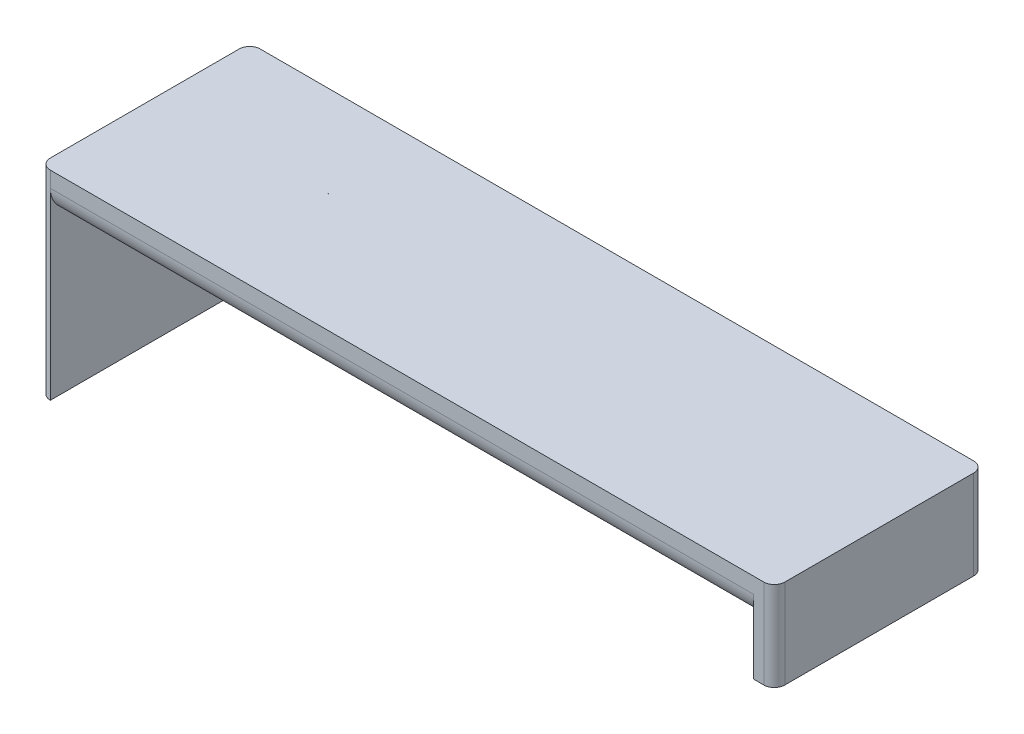
ISO-10303-21;
HEADER;
FILE_DESCRIPTION(('STEP AP214'),'2;1');
FILE_NAME('part.step','',(''),(''),'','','');
FILE_SCHEMA(('AUTOMOTIVE_DESIGN { 1 0 10303 214 1 1 1 1 }'));
ENDSEC;
DATA;
#1=APPLICATION_CONTEXT('core data for automotive mechanical design processes');
#2=APPLICATION_PROTOCOL_DEFINITION('international standard','automotive_design',2000,#1);
#3=PRODUCT_CONTEXT('',#1,'mechanical');
#4=PRODUCT('Part','Part','',(#3));
#5=PRODUCT_RELATED_PRODUCT_CATEGORY('part','',(#4));
#6=PRODUCT_DEFINITION_FORMATION('','',#4);
#7=PRODUCT_DEFINITION_CONTEXT('part definition',#1,'design');
#8=PRODUCT_DEFINITION('design','',#6,#7);
#9=PRODUCT_DEFINITION_SHAPE('','',#8);
#10=(LENGTH_UNIT() NAMED_UNIT(*) SI_UNIT(.MILLI.,.METRE.));
#11=(NAMED_UNIT(*) PLANE_ANGLE_UNIT() SI_UNIT($,.RADIAN.));
#12=(NAMED_UNIT(*) SI_UNIT($,.STERADIAN.) SOLID_ANGLE_UNIT());
#13=UNCERTAINTY_MEASURE_WITH_UNIT(LENGTH_MEASURE(1.E-05),#10,'distance_accuracy_value','');
#14=(GEOMETRIC_REPRESENTATION_CONTEXT(3) GLOBAL_UNCERTAINTY_ASSIGNED_CONTEXT((#13)) GLOBAL_UNIT_ASSIGNED_CONTEXT((#10,
#11,#12)) REPRESENTATION_CONTEXT('',''));
#15=CARTESIAN_POINT('',(0.,0.,0.));
#16=DIRECTION('',(0.,0.,1.));
#17=DIRECTION('',(1.,0.,0.));
#18=AXIS2_PLACEMENT_3D('',#15,#16,#17);
#19=CARTESIAN_POINT('',(66.,0.,0.));
#20=DIRECTION('',(1.,0.,0.));
#21=DIRECTION('',(0.,0.,-1.));
#22=AXIS2_PLACEMENT_3D('',#19,#20,#21);
#23=PLANE('',#22);
#24=DIRECTION('',(0.,0.,1.));
#25=VECTOR('',#24,1.);
#26=CARTESIAN_POINT('',(66.,0.,0.));
#27=LINE('',#26,#25);
#28=CARTESIAN_POINT('',(66.,0.,11.6553635721928));
#29=VERTEX_POINT('',#28);
#30=CARTESIAN_POINT('',(66.,0.,15.));
#31=VERTEX_POINT('',#30);
#32=EDGE_CURVE('E254',#29,#31,#27,.T.);
#33=ORIENTED_EDGE('',*,*,#32,.F.);
#34=DIRECTION('',(0.,-1.,0.));
#35=VECTOR('',#34,1.);
#36=CARTESIAN_POINT('',(66.,0.,11.6553635721928));
#37=LINE('',#36,#35);
#38=CARTESIAN_POINT('',(66.,-0.641854937593907,11.6553635721928));
#39=VERTEX_POINT('',#38);
#40=EDGE_CURVE('E238',#29,#39,#37,.T.);
#41=ORIENTED_EDGE('',*,*,#40,.T.);
#42=CARTESIAN_POINT('',(66.,-0.641854937593907,11.1553635721928));
#43=DIRECTION('',(1.,0.,0.));
#44=DIRECTION('',(0.,0.,-1.));
#45=AXIS2_PLACEMENT_3D('',#42,#43,#44);
#46=CIRCLE('',#45,0.5);
#47=CARTESIAN_POINT('',(66.,-0.874321011498911,10.7126904145661));
#48=VERTEX_POINT('',#47);
#49=EDGE_CURVE('E429',#39,#48,#46,.T.);
#50=ORIENTED_EDGE('',*,*,#49,.T.);
#51=CARTESIAN_POINT('',(66.,-6.5,0.));
#52=DIRECTION('',(1.,0.,0.));
#53=DIRECTION('',(0.,0.,-1.));
#54=AXIS2_PLACEMENT_3D('',#51,#52,#53);
#55=CIRCLE('',#54,12.1);
#56=CARTESIAN_POINT('',(66.,0.,10.2058806577385));
#57=VERTEX_POINT('',#56);
#58=EDGE_CURVE('E248',#48,#57,#55,.F.);
#59=ORIENTED_EDGE('',*,*,#58,.T.);
#60=CARTESIAN_POINT('',(66.,0.,-10.2058806577385));
#61=VERTEX_POINT('',#60);
#62=EDGE_CURVE('E262',#61,#57,#27,.T.);
#63=ORIENTED_EDGE('',*,*,#62,.F.);
#64=CARTESIAN_POINT('',(66.,-6.5,0.));
#65=DIRECTION('',(1.,0.,0.));
#66=DIRECTION('',(0.,0.,-1.));
#67=AXIS2_PLACEMENT_3D('',#64,#65,#66);
#68=CIRCLE('',#67,12.1);
#69=CARTESIAN_POINT('',(66.,-0.874321011498911,-10.7126904145661));
#70=VERTEX_POINT('',#69);
#71=EDGE_CURVE('E556',#61,#70,#68,.F.);
#72=ORIENTED_EDGE('',*,*,#71,.T.);
#73=CARTESIAN_POINT('',(66.,-0.641854937593907,-11.1553635721928));
#74=DIRECTION('',(1.,0.,0.));
#75=DIRECTION('',(0.,0.,-1.));
#76=AXIS2_PLACEMENT_3D('',#73,#74,#75);
#77=CIRCLE('',#76,0.5);
#78=CARTESIAN_POINT('',(66.,-0.641854937593907,-11.6553635721928));
#79=VERTEX_POINT('',#78);
#80=EDGE_CURVE('E425',#70,#79,#77,.T.);
#81=ORIENTED_EDGE('',*,*,#80,.T.);
#82=DIRECTION('',(0.,1.,0.));
#83=VECTOR('',#82,1.);
#84=CARTESIAN_POINT('',(66.,0.,-11.6553635721928));
#85=LINE('',#84,#83);
#86=CARTESIAN_POINT('',(66.,0.,-11.6553635721928));
#87=VERTEX_POINT('',#86);
#88=EDGE_CURVE('E560',#79,#87,#85,.T.);
#89=ORIENTED_EDGE('',*,*,#88,.T.);
#90=CARTESIAN_POINT('',(66.,0.,-15.));
#91=VERTEX_POINT('',#90);
#92=EDGE_CURVE('E265',#91,#87,#27,.T.);
#93=ORIENTED_EDGE('',*,*,#92,.F.);
#94=CARTESIAN_POINT('',(66.,5.,-15.));
#95=DIRECTION('',(1.,0.,0.));
#96=DIRECTION('',(0.,0.,-1.));
#97=AXIS2_PLACEMENT_3D('',#94,#95,#96);
#98=CIRCLE('',#97,5.);
#99=CARTESIAN_POINT('',(66.,5.,-20.));
#100=VERTEX_POINT('',#99);
#101=EDGE_CURVE('E377',#91,#100,#98,.T.);
#102=ORIENTED_EDGE('',*,*,#101,.T.);
#103=DIRECTION('',(0.,1.,0.));
#104=VECTOR('',#103,1.);
#105=CARTESIAN_POINT('',(66.,0.,-20.));
#106=LINE('',#105,#104);
#107=CARTESIAN_POINT('',(66.,-9.,-20.));
#108=VERTEX_POINT('',#107);
#109=EDGE_CURVE('E272',#108,#100,#106,.T.);
#110=ORIENTED_EDGE('',*,*,#109,.F.);
#111=DIRECTION('',(0.,0.,-1.));
#112=VECTOR('',#111,1.);
#113=CARTESIAN_POINT('',(66.,-9.,0.));
#114=LINE('',#113,#112);
#115=CARTESIAN_POINT('',(66.,-9.,-8.525));
#116=VERTEX_POINT('',#115);
#117=EDGE_CURVE('E277',#116,#108,#114,.T.);
#118=ORIENTED_EDGE('',*,*,#117,.F.);
#119=DIRECTION('',(0.,-1.,0.));
#120=VECTOR('',#119,1.);
#121=CARTESIAN_POINT('',(66.,0.,-8.525));
#122=LINE('',#121,#120);
#123=CARTESIAN_POINT('',(66.,-0.600000000000002,-8.525));
#124=VERTEX_POINT('',#123);
#125=EDGE_CURVE('E283',#124,#116,#122,.T.);
#126=ORIENTED_EDGE('',*,*,#125,.F.);
#127=DIRECTION('',(0.,0.,1.));
#128=VECTOR('',#127,1.);
#129=CARTESIAN_POINT('',(66.,-0.600000000000001,0.));
#130=LINE('',#129,#128);
#131=CARTESIAN_POINT('',(66.,-0.6,8.525));
#132=VERTEX_POINT('',#131);
#133=EDGE_CURVE('E307',#124,#132,#130,.T.);
#134=ORIENTED_EDGE('',*,*,#133,.T.);
#135=DIRECTION('',(0.,-1.,0.));
#136=VECTOR('',#135,1.);
#137=CARTESIAN_POINT('',(66.,0.,8.525));
#138=LINE('',#137,#136);
#139=CARTESIAN_POINT('',(66.,-9.,8.525));
#140=VERTEX_POINT('',#139);
#141=EDGE_CURVE('E588',#132,#140,#138,.T.);
#142=ORIENTED_EDGE('',*,*,#141,.T.);
#143=DIRECTION('',(0.,0.,-1.));
#144=VECTOR('',#143,1.);
#145=CARTESIAN_POINT('',(66.,-9.,0.));
#146=LINE('',#145,#144);
#147=CARTESIAN_POINT('',(66.,-9.,20.));
#148=VERTEX_POINT('',#147);
#149=EDGE_CURVE('E268',#148,#140,#146,.T.);
#150=ORIENTED_EDGE('',*,*,#149,.F.);
#151=DIRECTION('',(0.,-1.,0.));
#152=VECTOR('',#151,1.);
#153=CARTESIAN_POINT('',(66.,0.,20.));
#154=LINE('',#153,#152);
#155=CARTESIAN_POINT('',(66.,5.,20.));
#156=VERTEX_POINT('',#155);
#157=EDGE_CURVE('E263',#156,#148,#154,.T.);
#158=ORIENTED_EDGE('',*,*,#157,.F.);
#159=CARTESIAN_POINT('',(66.,5.,15.));
#160=DIRECTION('',(1.,0.,0.));
#161=DIRECTION('',(0.,0.,-1.));
#162=AXIS2_PLACEMENT_3D('',#159,#160,#161);
#163=CIRCLE('',#162,5.);
#164=EDGE_CURVE('E260',#156,#31,#163,.T.);
#165=ORIENTED_EDGE('',*,*,#164,.T.);
#166=EDGE_LOOP('',(#33,#41,#50,#59,#63,#72,#81,#89,#93,#102,#110,#118,#126,#134,#142,#150,#158,#165));
#167=FACE_BOUND('',#166,.T.);
#168=ADVANCED_FACE('F37',(#167),#23,.F.);
#169=CARTESIAN_POINT('',(-68.,-30.,0.));
#170=DIRECTION('',(-1.,0.,0.));
#171=DIRECTION('',(0.,0.,1.));
#172=AXIS2_PLACEMENT_3D('',#169,#170,#171);
#173=PLANE('',#172);
#174=CARTESIAN_POINT('',(-68.,-6.5,0.));
#175=DIRECTION('',(-1.,0.,0.));
#176=DIRECTION('',(0.,0.,1.));
#177=AXIS2_PLACEMENT_3D('',#174,#175,#176);
#178=CIRCLE('',#177,12.1);
#179=CARTESIAN_POINT('',(-68.,-0.874321011498911,10.7126904145661));
#180=VERTEX_POINT('',#179);
#181=CARTESIAN_POINT('',(-68.,-0.874321011498911,-10.7126904145661));
#182=VERTEX_POINT('',#181);
#183=EDGE_CURVE('E553',#180,#182,#178,.T.);
#184=ORIENTED_EDGE('',*,*,#183,.F.);
#185=CARTESIAN_POINT('',(-68.,-0.641854937593907,11.1553635721928));
#186=DIRECTION('',(-1.,0.,0.));
#187=DIRECTION('',(0.,0.,1.));
#188=AXIS2_PLACEMENT_3D('',#185,#186,#187);
#189=CIRCLE('',#188,0.5);
#190=CARTESIAN_POINT('',(-68.,-0.641854937593907,11.6553635721928));
#191=VERTEX_POINT('',#190);
#192=EDGE_CURVE('E431',#180,#191,#189,.T.);
#193=ORIENTED_EDGE('',*,*,#192,.T.);
#194=DIRECTION('',(0.,-1.,0.));
#195=VECTOR('',#194,1.);
#196=CARTESIAN_POINT('',(-68.,0.,11.6553635721928));
#197=LINE('',#196,#195);
#198=CARTESIAN_POINT('',(-68.,0.,11.6553635721928));
#199=VERTEX_POINT('',#198);
#200=EDGE_CURVE('E257',#199,#191,#197,.T.);
#201=ORIENTED_EDGE('',*,*,#200,.F.);
#202=DIRECTION('',(0.,0.,1.));
#203=VECTOR('',#202,1.);
#204=CARTESIAN_POINT('',(-68.,0.,0.));
#205=LINE('',#204,#203);
#206=CARTESIAN_POINT('',(-68.,0.,15.));
#207=VERTEX_POINT('',#206);
#208=EDGE_CURVE('E256',#199,#207,#205,.T.);
#209=ORIENTED_EDGE('',*,*,#208,.T.);
#210=CARTESIAN_POINT('',(-68.,5.,15.));
#211=DIRECTION('',(-1.,0.,0.));
#212=DIRECTION('',(0.,0.,1.));
#213=AXIS2_PLACEMENT_3D('',#210,#211,#212);
#214=CIRCLE('',#213,5.);
#215=CARTESIAN_POINT('',(-68.,5.,20.));
#216=VERTEX_POINT('',#215);
#217=EDGE_CURVE('E374',#207,#216,#214,.T.);
#218=ORIENTED_EDGE('',*,*,#217,.T.);
#219=DIRECTION('',(0.,1.,0.));
#220=VECTOR('',#219,1.);
#221=CARTESIAN_POINT('',(-68.,-30.,20.));
#222=LINE('',#221,#220);
#223=CARTESIAN_POINT('',(-68.,-30.,20.));
#224=VERTEX_POINT('',#223);
#225=EDGE_CURVE('E293',#224,#216,#222,.T.);
#226=ORIENTED_EDGE('',*,*,#225,.F.);
#227=DIRECTION('',(0.,0.,1.));
#228=VECTOR('',#227,1.);
#229=CARTESIAN_POINT('',(-68.,-30.,0.));
#230=LINE('',#229,#228);
#231=CARTESIAN_POINT('',(-68.,-30.,-20.));
#232=VERTEX_POINT('',#231);
#233=EDGE_CURVE('E575',#232,#224,#230,.T.);
#234=ORIENTED_EDGE('',*,*,#233,.F.);
#235=DIRECTION('',(0.,1.,0.));
#236=VECTOR('',#235,1.);
#237=CARTESIAN_POINT('',(-68.,-30.,-20.));
#238=LINE('',#237,#236);
#239=CARTESIAN_POINT('',(-68.,5.,-20.));
#240=VERTEX_POINT('',#239);
#241=EDGE_CURVE('E581',#232,#240,#238,.T.);
#242=ORIENTED_EDGE('',*,*,#241,.T.);
#243=CARTESIAN_POINT('',(-68.,5.,-15.));
#244=DIRECTION('',(-1.,0.,0.));
#245=DIRECTION('',(0.,0.,1.));
#246=AXIS2_PLACEMENT_3D('',#243,#244,#245);
#247=CIRCLE('',#246,5.);
#248=CARTESIAN_POINT('',(-68.,0.,-15.));
#249=VERTEX_POINT('',#248);
#250=EDGE_CURVE('E379',#240,#249,#247,.T.);
#251=ORIENTED_EDGE('',*,*,#250,.T.);
#252=CARTESIAN_POINT('',(-68.,0.,-11.6553635721928));
#253=VERTEX_POINT('',#252);
#254=EDGE_CURVE('E578',#249,#253,#205,.T.);
#255=ORIENTED_EDGE('',*,*,#254,.T.);
#256=DIRECTION('',(0.,1.,0.));
#257=VECTOR('',#256,1.);
#258=CARTESIAN_POINT('',(-68.,0.,-11.6553635721928));
#259=LINE('',#258,#257);
#260=CARTESIAN_POINT('',(-68.,-0.641854937593907,-11.6553635721928));
#261=VERTEX_POINT('',#260);
#262=EDGE_CURVE('E562',#261,#253,#259,.T.);
#263=ORIENTED_EDGE('',*,*,#262,.F.);
#264=CARTESIAN_POINT('',(-68.,-0.641854937593907,-11.1553635721928));
#265=DIRECTION('',(-1.,0.,0.));
#266=DIRECTION('',(0.,0.,1.));
#267=AXIS2_PLACEMENT_3D('',#264,#265,#266);
#268=CIRCLE('',#267,0.5);
#269=EDGE_CURVE('E427',#261,#182,#268,.T.);
#270=ORIENTED_EDGE('',*,*,#269,.T.);
#271=EDGE_LOOP('',(#184,#193,#201,#209,#218,#226,#234,#242,#251,#255,#263,#270));
#272=FACE_BOUND('',#271,.T.);
#273=ADVANCED_FACE('F454',(#272),#173,.F.);
#274=CARTESIAN_POINT('',(0.,0.,0.));
#275=DIRECTION('',(0.,1.,0.));
#276=DIRECTION('',(0.,0.,1.));
#277=AXIS2_PLACEMENT_3D('',#274,#275,#276);
#278=PLANE('',#277);
#279=ORIENTED_EDGE('',*,*,#208,.F.);
#280=DIRECTION('',(1.,0.,0.));
#281=VECTOR('',#280,1.);
#282=CARTESIAN_POINT('',(-71.5585812790064,0.,11.6553635721928));
#283=LINE('',#282,#281);
#284=EDGE_CURVE('E242',#199,#29,#283,.T.);
#285=ORIENTED_EDGE('',*,*,#284,.T.);
#286=ORIENTED_EDGE('',*,*,#32,.T.);
#287=DIRECTION('',(1.,0.,0.));
#288=VECTOR('',#287,1.);
#289=CARTESIAN_POINT('',(0.,0.,15.));
#290=LINE('',#289,#288);
#291=EDGE_CURVE('E369',#31,#207,#290,.F.);
#292=ORIENTED_EDGE('',*,*,#291,.T.);
#293=EDGE_LOOP('',(#279,#285,#286,#292));
#294=FACE_BOUND('',#293,.T.);
#295=ADVANCED_FACE('F252',(#294),#278,.F.);
#296=ORIENTED_EDGE('',*,*,#92,.T.);
#297=DIRECTION('',(1.,0.,0.));
#298=VECTOR('',#297,1.);
#299=CARTESIAN_POINT('',(-71.5585812790064,0.,-11.6553635721928));
#300=LINE('',#299,#298);
#301=EDGE_CURVE('E566',#253,#87,#300,.T.);
#302=ORIENTED_EDGE('',*,*,#301,.F.);
#303=ORIENTED_EDGE('',*,*,#254,.F.);
#304=DIRECTION('',(1.,0.,0.));
#305=VECTOR('',#304,1.);
#306=CARTESIAN_POINT('',(66.,0.,-15.));
#307=LINE('',#306,#305);
#308=EDGE_CURVE('E367',#249,#91,#307,.T.);
#309=ORIENTED_EDGE('',*,*,#308,.T.);
#310=EDGE_LOOP('',(#296,#302,#303,#309));
#311=FACE_BOUND('',#310,.T.);
#312=ADVANCED_FACE('F615',(#311),#278,.F.);
#313=DIRECTION('',(1.,0.,0.));
#314=VECTOR('',#313,1.);
#315=CARTESIAN_POINT('',(-71.5585812790064,0.,10.2058806577385));
#316=LINE('',#315,#314);
#317=CARTESIAN_POINT('',(65.,0.,10.2058806577385));
#318=VERTEX_POINT('',#317);
#319=EDGE_CURVE('E554',#318,#57,#316,.T.);
#320=ORIENTED_EDGE('',*,*,#319,.F.);
#321=DIRECTION('',(0.,0.,1.));
#322=VECTOR('',#321,1.);
#323=CARTESIAN_POINT('',(65.,0.,-10.2058806577385));
#324=LINE('',#323,#322);
#325=CARTESIAN_POINT('',(65.,0.,-10.2058806577385));
#326=VERTEX_POINT('',#325);
#327=EDGE_CURVE('E58',#318,#326,#324,.F.);
#328=ORIENTED_EDGE('',*,*,#327,.T.);
#329=DIRECTION('',(1.,0.,0.));
#330=VECTOR('',#329,1.);
#331=CARTESIAN_POINT('',(-71.5585812790064,0.,-10.2058806577385));
#332=LINE('',#331,#330);
#333=EDGE_CURVE('E567',#326,#61,#332,.T.);
#334=ORIENTED_EDGE('',*,*,#333,.T.);
#335=ORIENTED_EDGE('',*,*,#62,.T.);
#336=EDGE_LOOP('',(#320,#328,#334,#335));
#337=FACE_BOUND('',#336,.T.);
#338=ADVANCED_FACE('F500',(#337),#278,.F.);
#339=DIRECTION('',(1.,0.,0.));
#340=VECTOR('',#339,1.);
#341=CARTESIAN_POINT('',(67.,0.,9.125));
#342=LINE('',#341,#340);
#343=CARTESIAN_POINT('',(67.,0.,9.125));
#344=VERTEX_POINT('',#343);
#345=CARTESIAN_POINT('',(68.,0.,9.125));
#346=VERTEX_POINT('',#345);
#347=EDGE_CURVE('E336',#344,#346,#342,.T.);
#348=ORIENTED_EDGE('',*,*,#347,.F.);
#349=DIRECTION('',(0.,0.,1.));
#350=VECTOR('',#349,1.);
#351=CARTESIAN_POINT('',(67.,0.,0.));
#352=LINE('',#351,#350);
#353=CARTESIAN_POINT('',(67.,0.,-9.125));
#354=VERTEX_POINT('',#353);
#355=EDGE_CURVE('E298',#354,#344,#352,.T.);
#356=ORIENTED_EDGE('',*,*,#355,.F.);
#357=DIRECTION('',(1.,0.,0.));
#358=VECTOR('',#357,1.);
#359=CARTESIAN_POINT('',(67.,0.,-9.125));
#360=LINE('',#359,#358);
#361=CARTESIAN_POINT('',(68.,0.,-9.125));
#362=VERTEX_POINT('',#361);
#363=EDGE_CURVE('E325',#354,#362,#360,.T.);
#364=ORIENTED_EDGE('',*,*,#363,.T.);
#365=DIRECTION('',(0.,0.,1.));
#366=VECTOR('',#365,1.);
#367=CARTESIAN_POINT('',(68.,0.,0.));
#368=LINE('',#367,#366);
#369=EDGE_CURVE('E339',#362,#346,#368,.T.);
#370=ORIENTED_EDGE('',*,*,#369,.T.);
#371=EDGE_LOOP('',(#348,#356,#364,#370));
#372=FACE_BOUND('',#371,.T.);
#373=ADVANCED_FACE('F492',(#372),#278,.F.);
#374=CARTESIAN_POINT('',(68.,-9.,0.));
#375=DIRECTION('',(-1.,0.,0.));
#376=DIRECTION('',(0.,0.,1.));
#377=AXIS2_PLACEMENT_3D('',#374,#375,#376);
#378=PLANE('',#377);
#379=DIRECTION('',(0.,-1.,0.));
#380=VECTOR('',#379,1.);
#381=CARTESIAN_POINT('',(68.,0.,-9.125));
#382=LINE('',#381,#380);
#383=CARTESIAN_POINT('',(68.,-9.,-9.125));
#384=VERTEX_POINT('',#383);
#385=EDGE_CURVE('E317',#362,#384,#382,.T.);
#386=ORIENTED_EDGE('',*,*,#385,.T.);
#387=DIRECTION('',(0.,0.,1.));
#388=VECTOR('',#387,1.);
#389=CARTESIAN_POINT('',(68.,-9.,0.));
#390=LINE('',#389,#388);
#391=CARTESIAN_POINT('',(68.,-9.,9.125));
#392=VERTEX_POINT('',#391);
#393=EDGE_CURVE('E343',#384,#392,#390,.T.);
#394=ORIENTED_EDGE('',*,*,#393,.T.);
#395=DIRECTION('',(0.,-1.,0.));
#396=VECTOR('',#395,1.);
#397=CARTESIAN_POINT('',(68.,0.,9.125));
#398=LINE('',#397,#396);
#399=EDGE_CURVE('E327',#346,#392,#398,.T.);
#400=ORIENTED_EDGE('',*,*,#399,.F.);
#401=ORIENTED_EDGE('',*,*,#369,.F.);
#402=EDGE_LOOP('',(#386,#394,#400,#401));
#403=FACE_BOUND('',#402,.T.);
#404=ADVANCED_FACE('F488',(#403),#378,.T.);
#405=CARTESIAN_POINT('',(0.,8.,20.));
#406=DIRECTION('',(0.,0.,-1.));
#407=DIRECTION('',(-1.,0.,0.));
#408=AXIS2_PLACEMENT_3D('',#405,#406,#407);
#409=PLANE('',#408);
#410=DIRECTION('',(1.,0.,0.));
#411=VECTOR('',#410,1.);
#412=CARTESIAN_POINT('',(0.,8.,20.));
#413=LINE('',#412,#411);
#414=CARTESIAN_POINT('',(-68.,8.,20.));
#415=VERTEX_POINT('',#414);
#416=CARTESIAN_POINT('',(68.,8.,20.));
#417=VERTEX_POINT('',#416);
#418=EDGE_CURVE('E351',#415,#417,#413,.T.);
#419=ORIENTED_EDGE('',*,*,#418,.F.);
#420=DIRECTION('',(0.,-1.,0.));
#421=VECTOR('',#420,1.);
#422=CARTESIAN_POINT('',(-68.,8.,20.));
#423=LINE('',#422,#421);
#424=EDGE_CURVE('E383',#415,#216,#423,.T.);
#425=ORIENTED_EDGE('',*,*,#424,.T.);
#426=DIRECTION('',(1.,0.,0.));
#427=VECTOR('',#426,1.);
#428=CARTESIAN_POINT('',(0.,5.,20.));
#429=LINE('',#428,#427);
#430=EDGE_CURVE('E364',#216,#156,#429,.T.);
#431=ORIENTED_EDGE('',*,*,#430,.T.);
#432=ORIENTED_EDGE('',*,*,#157,.T.);
#433=DIRECTION('',(1.,0.,0.));
#434=VECTOR('',#433,1.);
#435=CARTESIAN_POINT('',(0.,-9.,20.));
#436=LINE('',#435,#434);
#437=CARTESIAN_POINT('',(68.,-9.,20.));
#438=VERTEX_POINT('',#437);
#439=EDGE_CURVE('E345',#148,#438,#436,.T.);
#440=ORIENTED_EDGE('',*,*,#439,.T.);
#441=DIRECTION('',(0.,-1.,0.));
#442=VECTOR('',#441,1.);
#443=CARTESIAN_POINT('',(68.,8.,20.));
#444=LINE('',#443,#442);
#445=EDGE_CURVE('E381',#438,#417,#444,.F.);
#446=ORIENTED_EDGE('',*,*,#445,.T.);
#447=EDGE_LOOP('',(#419,#425,#431,#432,#440,#446));
#448=FACE_BOUND('',#447,.T.);
#449=ADVANCED_FACE('F491',(#448),#409,.F.);
#450=CARTESIAN_POINT('',(70.,8.,0.));
#451=DIRECTION('',(1.,0.,0.));
#452=DIRECTION('',(0.,0.,-1.));
#453=AXIS2_PLACEMENT_3D('',#450,#451,#452);
#454=PLANE('',#453);
#455=DIRECTION('',(0.,0.,1.));
#456=VECTOR('',#455,1.);
#457=CARTESIAN_POINT('',(70.,8.,0.));
#458=LINE('',#457,#456);
#459=CARTESIAN_POINT('',(70.,8.,-18.));
#460=VERTEX_POINT('',#459);
#461=CARTESIAN_POINT('',(70.,8.,18.));
#462=VERTEX_POINT('',#461);
#463=EDGE_CURVE('E355',#460,#462,#458,.T.);
#464=ORIENTED_EDGE('',*,*,#463,.T.);
#465=DIRECTION('',(0.,-1.,0.));
#466=VECTOR('',#465,1.);
#467=CARTESIAN_POINT('',(70.,-9.,18.));
#468=LINE('',#467,#466);
#469=CARTESIAN_POINT('',(70.,-9.,18.));
#470=VERTEX_POINT('',#469);
#471=EDGE_CURVE('E410',#462,#470,#468,.T.);
#472=ORIENTED_EDGE('',*,*,#471,.T.);
#473=DIRECTION('',(0.,0.,1.));
#474=VECTOR('',#473,1.);
#475=CARTESIAN_POINT('',(70.,-9.,0.));
#476=LINE('',#475,#474);
#477=CARTESIAN_POINT('',(70.,-9.,-18.));
#478=VERTEX_POINT('',#477);
#479=EDGE_CURVE('E348',#478,#470,#476,.T.);
#480=ORIENTED_EDGE('',*,*,#479,.F.);
#481=DIRECTION('',(0.,-1.,0.));
#482=VECTOR('',#481,1.);
#483=CARTESIAN_POINT('',(70.,8.,-18.));
#484=LINE('',#483,#482);
#485=EDGE_CURVE('E408',#478,#460,#484,.F.);
#486=ORIENTED_EDGE('',*,*,#485,.T.);
#487=EDGE_LOOP('',(#464,#472,#480,#486));
#488=FACE_BOUND('',#487,.T.);
#489=ADVANCED_FACE('F508',(#488),#454,.T.);
#490=CARTESIAN_POINT('',(0.,8.,-20.));
#491=DIRECTION('',(0.,0.,-1.));
#492=DIRECTION('',(-1.,0.,0.));
#493=AXIS2_PLACEMENT_3D('',#490,#491,#492);
#494=PLANE('',#493);
#495=DIRECTION('',(1.,0.,0.));
#496=VECTOR('',#495,1.);
#497=CARTESIAN_POINT('',(-68.,5.,-20.));
#498=LINE('',#497,#496);
#499=EDGE_CURVE('E371',#100,#240,#498,.F.);
#500=ORIENTED_EDGE('',*,*,#499,.T.);
#501=DIRECTION('',(0.,-1.,0.));
#502=VECTOR('',#501,1.);
#503=CARTESIAN_POINT('',(-68.,8.,-20.));
#504=LINE('',#503,#502);
#505=CARTESIAN_POINT('',(-68.,8.,-20.));
#506=VERTEX_POINT('',#505);
#507=EDGE_CURVE('E406',#240,#506,#504,.F.);
#508=ORIENTED_EDGE('',*,*,#507,.T.);
#509=DIRECTION('',(1.,0.,0.));
#510=VECTOR('',#509,1.);
#511=CARTESIAN_POINT('',(0.,8.,-20.));
#512=LINE('',#511,#510);
#513=CARTESIAN_POINT('',(68.,8.,-20.));
#514=VERTEX_POINT('',#513);
#515=EDGE_CURVE('E358',#506,#514,#512,.T.);
#516=ORIENTED_EDGE('',*,*,#515,.T.);
#517=DIRECTION('',(0.,-1.,0.));
#518=VECTOR('',#517,1.);
#519=CARTESIAN_POINT('',(68.,8.,-20.));
#520=LINE('',#519,#518);
#521=CARTESIAN_POINT('',(68.,-9.,-20.));
#522=VERTEX_POINT('',#521);
#523=EDGE_CURVE('E403',#514,#522,#520,.T.);
#524=ORIENTED_EDGE('',*,*,#523,.T.);
#525=DIRECTION('',(1.,0.,0.));
#526=VECTOR('',#525,1.);
#527=CARTESIAN_POINT('',(0.,-9.,-20.));
#528=LINE('',#527,#526);
#529=EDGE_CURVE('E340',#108,#522,#528,.T.);
#530=ORIENTED_EDGE('',*,*,#529,.F.);
#531=ORIENTED_EDGE('',*,*,#109,.T.);
#532=EDGE_LOOP('',(#500,#508,#516,#524,#530,#531));
#533=FACE_BOUND('',#532,.T.);
#534=ADVANCED_FACE('F504',(#533),#494,.T.);
#535=CARTESIAN_POINT('',(-70.,8.,0.));
#536=DIRECTION('',(1.,0.,0.));
#537=DIRECTION('',(0.,0.,-1.));
#538=AXIS2_PLACEMENT_3D('',#535,#536,#537);
#539=PLANE('',#538);
#540=DIRECTION('',(0.,0.,1.));
#541=VECTOR('',#540,1.);
#542=CARTESIAN_POINT('',(-70.,-30.,0.));
#543=LINE('',#542,#541);
#544=CARTESIAN_POINT('',(-70.,-30.,-18.));
#545=VERTEX_POINT('',#544);
#546=CARTESIAN_POINT('',(-70.,-30.,18.));
#547=VERTEX_POINT('',#546);
#548=EDGE_CURVE('E577',#545,#547,#543,.T.);
#549=ORIENTED_EDGE('',*,*,#548,.T.);
#550=DIRECTION('',(0.,-1.,0.));
#551=VECTOR('',#550,1.);
#552=CARTESIAN_POINT('',(-70.,8.,18.));
#553=LINE('',#552,#551);
#554=CARTESIAN_POINT('',(-70.,8.,18.));
#555=VERTEX_POINT('',#554);
#556=EDGE_CURVE('E393',#547,#555,#553,.F.);
#557=ORIENTED_EDGE('',*,*,#556,.T.);
#558=DIRECTION('',(0.,0.,1.));
#559=VECTOR('',#558,1.);
#560=CARTESIAN_POINT('',(-70.,8.,0.));
#561=LINE('',#560,#559);
#562=CARTESIAN_POINT('',(-70.,8.,-18.));
#563=VERTEX_POINT('',#562);
#564=EDGE_CURVE('E361',#563,#555,#561,.T.);
#565=ORIENTED_EDGE('',*,*,#564,.F.);
#566=DIRECTION('',(0.,-1.,0.));
#567=VECTOR('',#566,1.);
#568=CARTESIAN_POINT('',(-70.,-30.,-18.));
#569=LINE('',#568,#567);
#570=EDGE_CURVE('E390',#563,#545,#569,.T.);
#571=ORIENTED_EDGE('',*,*,#570,.T.);
#572=EDGE_LOOP('',(#549,#557,#565,#571));
#573=FACE_BOUND('',#572,.T.);
#574=ADVANCED_FACE('F496',(#573),#539,.F.);
#575=CARTESIAN_POINT('',(0.,8.,0.));
#576=DIRECTION('',(0.,1.,0.));
#577=DIRECTION('',(0.,0.,1.));
#578=AXIS2_PLACEMENT_3D('',#575,#576,#577);
#579=PLANE('',#578);
#580=ORIENTED_EDGE('',*,*,#564,.T.);
#581=CARTESIAN_POINT('',(-68.,8.,18.));
#582=DIRECTION('',(0.,1.,0.));
#583=DIRECTION('',(0.,0.,1.));
#584=AXIS2_PLACEMENT_3D('',#581,#582,#583);
#585=CIRCLE('',#584,2.);
#586=EDGE_CURVE('E401',#555,#415,#585,.T.);
#587=ORIENTED_EDGE('',*,*,#586,.T.);
#588=ORIENTED_EDGE('',*,*,#418,.T.);
#589=CARTESIAN_POINT('',(68.,8.,18.));
#590=DIRECTION('',(0.,1.,0.));
#591=DIRECTION('',(0.,0.,1.));
#592=AXIS2_PLACEMENT_3D('',#589,#590,#591);
#593=CIRCLE('',#592,2.);
#594=EDGE_CURVE('E397',#417,#462,#593,.T.);
#595=ORIENTED_EDGE('',*,*,#594,.T.);
#596=ORIENTED_EDGE('',*,*,#463,.F.);
#597=CARTESIAN_POINT('',(68.,8.,-18.));
#598=DIRECTION('',(0.,1.,0.));
#599=DIRECTION('',(0.,0.,1.));
#600=AXIS2_PLACEMENT_3D('',#597,#598,#599);
#601=CIRCLE('',#600,2.);
#602=EDGE_CURVE('E395',#460,#514,#601,.T.);
#603=ORIENTED_EDGE('',*,*,#602,.T.);
#604=ORIENTED_EDGE('',*,*,#515,.F.);
#605=CARTESIAN_POINT('',(-68.,8.,-18.));
#606=DIRECTION('',(0.,1.,0.));
#607=DIRECTION('',(0.,0.,1.));
#608=AXIS2_PLACEMENT_3D('',#605,#606,#607);
#609=CIRCLE('',#608,2.);
#610=EDGE_CURVE('E399',#506,#563,#609,.T.);
#611=ORIENTED_EDGE('',*,*,#610,.T.);
#612=EDGE_LOOP('',(#580,#587,#588,#595,#596,#603,#604,#611));
#613=FACE_BOUND('',#612,.T.);
#614=ADVANCED_FACE('F486',(#613),#579,.T.);
#615=CARTESIAN_POINT('',(0.,-9.,0.));
#616=DIRECTION('',(0.,1.,0.));
#617=DIRECTION('',(0.,0.,1.));
#618=AXIS2_PLACEMENT_3D('',#615,#616,#617);
#619=PLANE('',#618);
#620=ORIENTED_EDGE('',*,*,#479,.T.);
#621=CARTESIAN_POINT('',(68.,-9.,18.));
#622=DIRECTION('',(0.,1.,0.));
#623=DIRECTION('',(0.,0.,1.));
#624=AXIS2_PLACEMENT_3D('',#621,#622,#623);
#625=CIRCLE('',#624,2.);
#626=EDGE_CURVE('E415',#470,#438,#625,.F.);
#627=ORIENTED_EDGE('',*,*,#626,.T.);
#628=ORIENTED_EDGE('',*,*,#439,.F.);
#629=ORIENTED_EDGE('',*,*,#149,.T.);
#630=DIRECTION('',(1.,0.,0.));
#631=VECTOR('',#630,1.);
#632=CARTESIAN_POINT('',(66.,-9.,8.525));
#633=LINE('',#632,#631);
#634=CARTESIAN_POINT('',(67.,-9.,8.525));
#635=VERTEX_POINT('',#634);
#636=EDGE_CURVE('E311',#140,#635,#633,.T.);
#637=ORIENTED_EDGE('',*,*,#636,.T.);
#638=DIRECTION('',(0.,0.,-1.));
#639=VECTOR('',#638,1.);
#640=CARTESIAN_POINT('',(67.,-9.,0.));
#641=LINE('',#640,#639);
#642=CARTESIAN_POINT('',(67.,-9.,9.125));
#643=VERTEX_POINT('',#642);
#644=EDGE_CURVE('E296',#643,#635,#641,.T.);
#645=ORIENTED_EDGE('',*,*,#644,.F.);
#646=DIRECTION('',(1.,0.,0.));
#647=VECTOR('',#646,1.);
#648=CARTESIAN_POINT('',(67.,-9.,9.125));
#649=LINE('',#648,#647);
#650=EDGE_CURVE('E331',#643,#392,#649,.T.);
#651=ORIENTED_EDGE('',*,*,#650,.T.);
#652=ORIENTED_EDGE('',*,*,#393,.F.);
#653=DIRECTION('',(1.,0.,0.));
#654=VECTOR('',#653,1.);
#655=CARTESIAN_POINT('',(67.,-9.,-9.125));
#656=LINE('',#655,#654);
#657=CARTESIAN_POINT('',(67.,-9.,-9.125));
#658=VERTEX_POINT('',#657);
#659=EDGE_CURVE('E320',#658,#384,#656,.T.);
#660=ORIENTED_EDGE('',*,*,#659,.F.);
#661=DIRECTION('',(0.,0.,-1.));
#662=VECTOR('',#661,1.);
#663=CARTESIAN_POINT('',(67.,-9.,0.));
#664=LINE('',#663,#662);
#665=CARTESIAN_POINT('',(67.,-9.,-8.525));
#666=VERTEX_POINT('',#665);
#667=EDGE_CURVE('E301',#666,#658,#664,.T.);
#668=ORIENTED_EDGE('',*,*,#667,.F.);
#669=DIRECTION('',(1.,0.,0.));
#670=VECTOR('',#669,1.);
#671=CARTESIAN_POINT('',(66.,-9.,-8.525));
#672=LINE('',#671,#670);
#673=EDGE_CURVE('E309',#116,#666,#672,.T.);
#674=ORIENTED_EDGE('',*,*,#673,.F.);
#675=ORIENTED_EDGE('',*,*,#117,.T.);
#676=ORIENTED_EDGE('',*,*,#529,.T.);
#677=CARTESIAN_POINT('',(68.,-9.,-18.));
#678=DIRECTION('',(0.,1.,0.));
#679=DIRECTION('',(0.,0.,1.));
#680=AXIS2_PLACEMENT_3D('',#677,#678,#679);
#681=CIRCLE('',#680,2.);
#682=EDGE_CURVE('E413',#522,#478,#681,.F.);
#683=ORIENTED_EDGE('',*,*,#682,.T.);
#684=EDGE_LOOP('',(#620,#627,#628,#629,#637,#645,#651,#652,#660,#668,#674,#675,#676,#683));
#685=FACE_BOUND('',#684,.T.);
#686=ADVANCED_FACE('F482',(#685),#619,.F.);
#687=CARTESIAN_POINT('',(67.,0.,9.125));
#688=DIRECTION('',(0.,0.,1.));
#689=DIRECTION('',(0.,-1.,0.));
#690=AXIS2_PLACEMENT_3D('',#687,#688,#689);
#691=PLANE('',#690);
#692=ORIENTED_EDGE('',*,*,#399,.T.);
#693=ORIENTED_EDGE('',*,*,#650,.F.);
#694=DIRECTION('',(0.,-1.,0.));
#695=VECTOR('',#694,1.);
#696=CARTESIAN_POINT('',(67.,0.,9.125));
#697=LINE('',#696,#695);
#698=EDGE_CURVE('E328',#344,#643,#697,.T.);
#699=ORIENTED_EDGE('',*,*,#698,.F.);
#700=ORIENTED_EDGE('',*,*,#347,.T.);
#701=EDGE_LOOP('',(#692,#693,#699,#700));
#702=FACE_BOUND('',#701,.T.);
#703=ADVANCED_FACE('F478',(#702),#691,.F.);
#704=CARTESIAN_POINT('',(67.,0.,-9.125));
#705=DIRECTION('',(0.,0.,1.));
#706=DIRECTION('',(0.,-1.,0.));
#707=AXIS2_PLACEMENT_3D('',#704,#705,#706);
#708=PLANE('',#707);
#709=ORIENTED_EDGE('',*,*,#385,.F.);
#710=ORIENTED_EDGE('',*,*,#363,.F.);
#711=DIRECTION('',(0.,-1.,0.));
#712=VECTOR('',#711,1.);
#713=CARTESIAN_POINT('',(67.,0.,-9.125));
#714=LINE('',#713,#712);
#715=EDGE_CURVE('E318',#354,#658,#714,.T.);
#716=ORIENTED_EDGE('',*,*,#715,.T.);
#717=ORIENTED_EDGE('',*,*,#659,.T.);
#718=EDGE_LOOP('',(#709,#710,#716,#717));
#719=FACE_BOUND('',#718,.T.);
#720=ADVANCED_FACE('F464',(#719),#708,.T.);
#721=CARTESIAN_POINT('',(67.,0.,0.));
#722=DIRECTION('',(1.,0.,0.));
#723=DIRECTION('',(0.,0.,-1.));
#724=AXIS2_PLACEMENT_3D('',#721,#722,#723);
#725=PLANE('',#724);
#726=ORIENTED_EDGE('',*,*,#698,.T.);
#727=ORIENTED_EDGE('',*,*,#644,.T.);
#728=DIRECTION('',(0.,-1.,0.));
#729=VECTOR('',#728,1.);
#730=CARTESIAN_POINT('',(67.,0.,8.525));
#731=LINE('',#730,#729);
#732=CARTESIAN_POINT('',(67.,-0.6,8.525));
#733=VERTEX_POINT('',#732);
#734=EDGE_CURVE('E292',#733,#635,#731,.T.);
#735=ORIENTED_EDGE('',*,*,#734,.F.);
#736=DIRECTION('',(0.,0.,1.));
#737=VECTOR('',#736,1.);
#738=CARTESIAN_POINT('',(67.,-0.600000000000001,0.));
#739=LINE('',#738,#737);
#740=CARTESIAN_POINT('',(67.,-0.600000000000002,-8.525));
#741=VERTEX_POINT('',#740);
#742=EDGE_CURVE('E289',#741,#733,#739,.T.);
#743=ORIENTED_EDGE('',*,*,#742,.F.);
#744=DIRECTION('',(0.,-1.,0.));
#745=VECTOR('',#744,1.);
#746=CARTESIAN_POINT('',(67.,0.,-8.525));
#747=LINE('',#746,#745);
#748=EDGE_CURVE('E304',#741,#666,#747,.T.);
#749=ORIENTED_EDGE('',*,*,#748,.T.);
#750=ORIENTED_EDGE('',*,*,#667,.T.);
#751=ORIENTED_EDGE('',*,*,#715,.F.);
#752=ORIENTED_EDGE('',*,*,#355,.T.);
#753=EDGE_LOOP('',(#726,#727,#735,#743,#749,#750,#751,#752));
#754=FACE_BOUND('',#753,.T.);
#755=ADVANCED_FACE('F460',(#754),#725,.T.);
#756=CARTESIAN_POINT('',(66.,-0.600000000000001,0.));
#757=DIRECTION('',(0.,1.,0.));
#758=DIRECTION('',(0.,0.,1.));
#759=AXIS2_PLACEMENT_3D('',#756,#757,#758);
#760=PLANE('',#759);
#761=ORIENTED_EDGE('',*,*,#742,.T.);
#762=DIRECTION('',(1.,0.,0.));
#763=VECTOR('',#762,1.);
#764=CARTESIAN_POINT('',(66.,-0.6,8.525));
#765=LINE('',#764,#763);
#766=EDGE_CURVE('E314',#132,#733,#765,.T.);
#767=ORIENTED_EDGE('',*,*,#766,.F.);
#768=ORIENTED_EDGE('',*,*,#133,.F.);
#769=DIRECTION('',(1.,0.,0.));
#770=VECTOR('',#769,1.);
#771=CARTESIAN_POINT('',(66.,-0.600000000000002,-8.525));
#772=LINE('',#771,#770);
#773=EDGE_CURVE('E288',#124,#741,#772,.T.);
#774=ORIENTED_EDGE('',*,*,#773,.T.);
#775=EDGE_LOOP('',(#761,#767,#768,#774));
#776=FACE_BOUND('',#775,.T.);
#777=ADVANCED_FACE('F463',(#776),#760,.F.);
#778=CARTESIAN_POINT('',(66.,0.,8.525));
#779=DIRECTION('',(0.,0.,1.));
#780=DIRECTION('',(1.,0.,0.));
#781=AXIS2_PLACEMENT_3D('',#778,#779,#780);
#782=PLANE('',#781);
#783=ORIENTED_EDGE('',*,*,#734,.T.);
#784=ORIENTED_EDGE('',*,*,#636,.F.);
#785=ORIENTED_EDGE('',*,*,#141,.F.);
#786=ORIENTED_EDGE('',*,*,#766,.T.);
#787=EDGE_LOOP('',(#783,#784,#785,#786));
#788=FACE_BOUND('',#787,.T.);
#789=ADVANCED_FACE('F468',(#788),#782,.F.);
#790=CARTESIAN_POINT('',(66.,0.,-8.525));
#791=DIRECTION('',(0.,0.,1.));
#792=DIRECTION('',(1.,0.,0.));
#793=AXIS2_PLACEMENT_3D('',#790,#791,#792);
#794=PLANE('',#793);
#795=ORIENTED_EDGE('',*,*,#748,.F.);
#796=ORIENTED_EDGE('',*,*,#773,.F.);
#797=ORIENTED_EDGE('',*,*,#125,.T.);
#798=ORIENTED_EDGE('',*,*,#673,.T.);
#799=EDGE_LOOP('',(#795,#796,#797,#798));
#800=FACE_BOUND('',#799,.T.);
#801=ADVANCED_FACE('F452',(#800),#794,.T.);
#802=CARTESIAN_POINT('',(0.,-30.,0.));
#803=DIRECTION('',(0.,1.,0.));
#804=DIRECTION('',(0.,0.,1.));
#805=AXIS2_PLACEMENT_3D('',#802,#803,#804);
#806=PLANE('',#805);
#807=ORIENTED_EDGE('',*,*,#233,.T.);
#808=CARTESIAN_POINT('',(-68.,-30.,18.));
#809=DIRECTION('',(0.,1.,0.));
#810=DIRECTION('',(0.,0.,1.));
#811=AXIS2_PLACEMENT_3D('',#808,#809,#810);
#812=CIRCLE('',#811,2.);
#813=EDGE_CURVE('E388',#224,#547,#812,.F.);
#814=ORIENTED_EDGE('',*,*,#813,.T.);
#815=ORIENTED_EDGE('',*,*,#548,.F.);
#816=CARTESIAN_POINT('',(-68.,-30.,-18.));
#817=DIRECTION('',(0.,1.,0.));
#818=DIRECTION('',(0.,0.,1.));
#819=AXIS2_PLACEMENT_3D('',#816,#817,#818);
#820=CIRCLE('',#819,2.);
#821=EDGE_CURVE('E386',#545,#232,#820,.F.);
#822=ORIENTED_EDGE('',*,*,#821,.T.);
#823=EDGE_LOOP('',(#807,#814,#815,#822));
#824=FACE_BOUND('',#823,.T.);
#825=ADVANCED_FACE('F448',(#824),#806,.F.);
#826=CARTESIAN_POINT('',(64.,0.,0.));
#827=DIRECTION('',(-1.,0.,0.));
#828=DIRECTION('',(0.,0.,1.));
#829=AXIS2_PLACEMENT_3D('',#826,#827,#828);
#830=PLANE('',#829);
#831=CARTESIAN_POINT('',(64.,-6.5,0.));
#832=DIRECTION('',(-1.,0.,0.));
#833=DIRECTION('',(0.,0.,1.));
#834=AXIS2_PLACEMENT_3D('',#831,#832,#833);
#835=CIRCLE('',#834,12.1);
#836=CARTESIAN_POINT('',(64.,1.,9.49526197637538));
#837=VERTEX_POINT('',#836);
#838=CARTESIAN_POINT('',(64.,1.,-9.49526197637538));
#839=VERTEX_POINT('',#838);
#840=EDGE_CURVE('E569',#837,#839,#835,.T.);
#841=ORIENTED_EDGE('',*,*,#840,.T.);
#842=DIRECTION('',(0.,0.,1.));
#843=VECTOR('',#842,1.);
#844=CARTESIAN_POINT('',(64.,1.,10.2058806577385));
#845=LINE('',#844,#843);
#846=EDGE_CURVE('E433',#839,#837,#845,.T.);
#847=ORIENTED_EDGE('',*,*,#846,.T.);
#848=EDGE_LOOP('',(#841,#847));
#849=FACE_BOUND('',#848,.T.);
#850=ADVANCED_FACE('F446',(#849),#830,.T.);
#851=CARTESIAN_POINT('',(-102.223968209429,-6.5,0.));
#852=DIRECTION('',(1.,0.,0.));
#853=DIRECTION('',(0.,0.,-1.));
#854=AXIS2_PLACEMENT_3D('',#851,#852,#853);
#855=CYLINDRICAL_SURFACE('',#854,12.1);
#856=ORIENTED_EDGE('',*,*,#183,.T.);
#857=DIRECTION('',(1.,0.,0.));
#858=VECTOR('',#857,1.);
#859=CARTESIAN_POINT('',(-102.223968209429,-0.874321011498909,-10.7126904145661));
#860=LINE('',#859,#858);
#861=EDGE_CURVE('E419',#182,#70,#860,.T.);
#862=ORIENTED_EDGE('',*,*,#861,.T.);
#863=ORIENTED_EDGE('',*,*,#71,.F.);
#864=ORIENTED_EDGE('',*,*,#333,.F.);
#865=CARTESIAN_POINT('',(65.,0.,-10.2058806577385));
#866=CARTESIAN_POINT('',(64.9751544159094,-1.68802113916126E-06,-10.205881150412));
#867=CARTESIAN_POINT('',(64.9503218899276,0.000926694377410494,-10.2052905145459));
#868=CARTESIAN_POINT('',(64.9008574942696,0.00461788510218007,-10.2029384677534));
#869=CARTESIAN_POINT('',(64.8762255607298,0.00738008446784394,-10.2011774454802));
#870=CARTESIAN_POINT('',(64.8031244279293,0.018341270152757,-10.1941800126306));
#871=CARTESIAN_POINT('',(64.7551854389597,0.0292154596813867,-10.1872289402112));
#872=CARTESIAN_POINT('',(64.6622361231031,0.0575144714662004,-10.169035444924));
#873=CARTESIAN_POINT('',(64.6172233542653,0.0749337473029305,-10.1577966554183));
#874=CARTESIAN_POINT('',(64.531054776287,0.115488993029772,-10.1314307307627));
#875=CARTESIAN_POINT('',(64.4899021355648,0.138629603359748,-10.1163004389036));
#876=CARTESIAN_POINT('',(64.4102282338582,0.190953525329065,-10.0817741154047));
#877=CARTESIAN_POINT('',(64.371948533417,0.220384999623449,-10.0621997565629));
#878=CARTESIAN_POINT('',(64.3009560532654,0.283347054632983,-10.01986240369));
#879=CARTESIAN_POINT('',(64.2682449472028,0.316878862523487,-9.99709845475823));
#880=CARTESIAN_POINT('',(64.204244411637,0.39209218424397,-9.94542268553836));
#881=CARTESIAN_POINT('',(64.173850374182,0.434250182408467,-9.91609809863456));
#882=CARTESIAN_POINT('',(64.1205740646427,0.521234613180081,-9.85469966297123));
#883=CARTESIAN_POINT('',(64.0976985774332,0.566063413116047,-9.82262336374769));
#884=CARTESIAN_POINT('',(64.0557825253758,0.665530205557573,-9.75036428782651));
#885=CARTESIAN_POINT('',(64.0381880312143,0.720473685989868,-9.7097658221999));
#886=CARTESIAN_POINT('',(64.0127539828355,0.831003217665794,-9.62658646911529));
#887=CARTESIAN_POINT('',(64.0049059555106,0.886588668314396,-9.58400733701455));
#888=CARTESIAN_POINT('',(64.0005596548754,0.961322975222685,-9.52571663102298));
#889=CARTESIAN_POINT('',(64.0000004356525,0.980689500111121,-9.51051593016804));
#890=CARTESIAN_POINT('',(64.,1.,-9.49526197637538));
#891=B_SPLINE_CURVE_WITH_KNOTS('',3,(#865,#866,#867,#868,#869,#870,#871,#872,#873,#874,#875,
#876,#877,#878,#879,#880,#881,#882,#883,#884,#885,#886,#887,#888,#889,#890),.UNSPECIFIED.,.F.,
.F.,(4,2,2,2,2,2,2,2,2,2,2,2,4),(0.,0.0744869933693139,0.14894926400535,0.297091371846385,
0.445108223599225,0.593245524453743,0.748944814094659,0.904690817042064,1.08304136965403,
1.26155242990917,1.4724111932741,1.68308651759828,1.7569331477734),.UNSPECIFIED.);
#892=EDGE_CURVE('E11',#326,#839,#891,.T.);
#893=ORIENTED_EDGE('',*,*,#892,.T.);
#894=ORIENTED_EDGE('',*,*,#840,.F.);
#895=CARTESIAN_POINT('',(64.,1.,9.49526197637538));
#896=CARTESIAN_POINT('',(63.9999986602422,0.933749871026446,9.54764443489046));
#897=CARTESIAN_POINT('',(64.0065969702487,0.866694303506829,9.59943078957927));
#898=CARTESIAN_POINT('',(64.0338838863508,0.73294957021114,9.7005794546519));
#899=CARTESIAN_POINT('',(64.0546660885562,0.666265823226121,9.74992331334226));
#900=CARTESIAN_POINT('',(64.1054110491945,0.549579209913714,9.83450901510878));
#901=CARTESIAN_POINT('',(64.132602998332,0.498968476210706,9.87056272358393));
#902=CARTESIAN_POINT('',(64.1966756640848,0.401627014114878,9.93886546562391));
#903=CARTESIAN_POINT('',(64.233526625543,0.354884940103208,9.97112575040061));
#904=CARTESIAN_POINT('',(64.3102411880924,0.274174073912696,10.0260944578183));
#905=CARTESIAN_POINT('',(64.3487027208235,0.239354814039594,10.0495064552009));
#906=CARTESIAN_POINT('',(64.4320804313301,0.175239788081572,10.0922077633735));
#907=CARTESIAN_POINT('',(64.4769985337708,0.145945675052257,10.1114958405675));
#908=CARTESIAN_POINT('',(64.5727312679218,0.0942285685146448,10.1453002072558));
#909=CARTESIAN_POINT('',(64.6235838452354,0.0718535517208812,10.1597832269725));
#910=CARTESIAN_POINT('',(64.729436435844,0.0356831603591743,10.1830897585887));
#911=CARTESIAN_POINT('',(64.7844282382273,0.0218712773062635,10.1919241612423));
#912=CARTESIAN_POINT('',(64.8667282764841,0.00855982126639807,10.2004250388827));
#913=CARTESIAN_POINT('',(64.8932504556431,0.00535460323308059,10.202468859109));
#914=CARTESIAN_POINT('',(64.9465092309371,0.00107497069097348,10.2051961185014));
#915=CARTESIAN_POINT('',(64.9732455926273,-1.51970679788641E-06,10.2058808829916));
#916=CARTESIAN_POINT('',(65.,0.,10.2058806577385));
#917=B_SPLINE_CURVE_WITH_KNOTS('',3,(#895,#896,#897,#898,#899,#900,#901,#902,#903,#904,#905,
#906,#907,#908,#909,#910,#911,#912,#913,#914,#915,#916),.UNSPECIFIED.,.F.,.F.,(4,2,2,2,2,2,2,2,
2,2,4),(0.,0.253542386027903,0.508774222800409,0.711461374917773,0.913531329524428,
1.08358989531972,1.25369926010467,1.42496299428309,1.59589552159171,1.67617158346011,
1.75636932317458),.UNSPECIFIED.);
#918=EDGE_CURVE('E51',#837,#318,#917,.T.);
#919=ORIENTED_EDGE('',*,*,#918,.T.);
#920=ORIENTED_EDGE('',*,*,#319,.T.);
#921=ORIENTED_EDGE('',*,*,#58,.F.);
#922=DIRECTION('',(1.,0.,0.));
#923=VECTOR('',#922,1.);
#924=CARTESIAN_POINT('',(-102.223968209429,-0.874321011498909,10.7126904145661));
#925=LINE('',#924,#923);
#926=EDGE_CURVE('E417',#48,#180,#925,.F.);
#927=ORIENTED_EDGE('',*,*,#926,.T.);
#928=EDGE_LOOP('',(#856,#862,#863,#864,#893,#894,#919,#920,#921,#927));
#929=FACE_BOUND('',#928,.T.);
#930=ADVANCED_FACE('F440',(#929),#855,.F.);
#931=CARTESIAN_POINT('',(0.,5.,15.));
#932=DIRECTION('',(1.,0.,0.));
#933=DIRECTION('',(0.,0.,-1.));
#934=AXIS2_PLACEMENT_3D('',#931,#932,#933);
#935=CYLINDRICAL_SURFACE('',#934,5.);
#936=ORIENTED_EDGE('',*,*,#217,.F.);
#937=ORIENTED_EDGE('',*,*,#291,.F.);
#938=ORIENTED_EDGE('',*,*,#164,.F.);
#939=ORIENTED_EDGE('',*,*,#430,.F.);
#940=EDGE_LOOP('',(#936,#937,#938,#939));
#941=FACE_BOUND('',#940,.T.);
#942=ADVANCED_FACE('F445',(#941),#935,.T.);
#943=CARTESIAN_POINT('',(0.,5.,-15.));
#944=DIRECTION('',(-1.,0.,0.));
#945=DIRECTION('',(0.,0.,1.));
#946=AXIS2_PLACEMENT_3D('',#943,#944,#945);
#947=CYLINDRICAL_SURFACE('',#946,5.);
#948=ORIENTED_EDGE('',*,*,#250,.F.);
#949=ORIENTED_EDGE('',*,*,#499,.F.);
#950=ORIENTED_EDGE('',*,*,#101,.F.);
#951=ORIENTED_EDGE('',*,*,#308,.F.);
#952=EDGE_LOOP('',(#948,#949,#950,#951));
#953=FACE_BOUND('',#952,.T.);
#954=ADVANCED_FACE('F517',(#953),#947,.T.);
#955=CARTESIAN_POINT('',(-68.,8.,18.));
#956=DIRECTION('',(0.,-1.,0.));
#957=DIRECTION('',(0.,0.,-1.));
#958=AXIS2_PLACEMENT_3D('',#955,#956,#957);
#959=CYLINDRICAL_SURFACE('',#958,2.);
#960=ORIENTED_EDGE('',*,*,#586,.F.);
#961=ORIENTED_EDGE('',*,*,#556,.F.);
#962=ORIENTED_EDGE('',*,*,#813,.F.);
#963=ORIENTED_EDGE('',*,*,#225,.T.);
#964=ORIENTED_EDGE('',*,*,#424,.F.);
#965=EDGE_LOOP('',(#960,#961,#962,#963,#964));
#966=FACE_BOUND('',#965,.T.);
#967=ADVANCED_FACE('F521',(#966),#959,.T.);
#968=CARTESIAN_POINT('',(-68.,8.,-18.));
#969=DIRECTION('',(0.,1.,0.));
#970=DIRECTION('',(0.,0.,1.));
#971=AXIS2_PLACEMENT_3D('',#968,#969,#970);
#972=CYLINDRICAL_SURFACE('',#971,2.);
#973=ORIENTED_EDGE('',*,*,#507,.F.);
#974=ORIENTED_EDGE('',*,*,#241,.F.);
#975=ORIENTED_EDGE('',*,*,#821,.F.);
#976=ORIENTED_EDGE('',*,*,#570,.F.);
#977=ORIENTED_EDGE('',*,*,#610,.F.);
#978=EDGE_LOOP('',(#973,#974,#975,#976,#977));
#979=FACE_BOUND('',#978,.T.);
#980=ADVANCED_FACE('F525',(#979),#972,.T.);
#981=CARTESIAN_POINT('',(68.,8.,18.));
#982=DIRECTION('',(0.,1.,0.));
#983=DIRECTION('',(0.,0.,1.));
#984=AXIS2_PLACEMENT_3D('',#981,#982,#983);
#985=CYLINDRICAL_SURFACE('',#984,2.);
#986=ORIENTED_EDGE('',*,*,#594,.F.);
#987=ORIENTED_EDGE('',*,*,#445,.F.);
#988=ORIENTED_EDGE('',*,*,#626,.F.);
#989=ORIENTED_EDGE('',*,*,#471,.F.);
#990=EDGE_LOOP('',(#986,#987,#988,#989));
#991=FACE_BOUND('',#990,.T.);
#992=ADVANCED_FACE('F529',(#991),#985,.T.);
#993=CARTESIAN_POINT('',(68.,8.,-18.));
#994=DIRECTION('',(0.,-1.,0.));
#995=DIRECTION('',(0.,0.,-1.));
#996=AXIS2_PLACEMENT_3D('',#993,#994,#995);
#997=CYLINDRICAL_SURFACE('',#996,2.);
#998=ORIENTED_EDGE('',*,*,#602,.F.);
#999=ORIENTED_EDGE('',*,*,#485,.F.);
#1000=ORIENTED_EDGE('',*,*,#682,.F.);
#1001=ORIENTED_EDGE('',*,*,#523,.F.);
#1002=EDGE_LOOP('',(#998,#999,#1000,#1001));
#1003=FACE_BOUND('',#1002,.T.);
#1004=ADVANCED_FACE('F533',(#1003),#997,.T.);
#1005=CARTESIAN_POINT('',(-71.5585812790064,0.,-11.6553635721928));
#1006=DIRECTION('',(0.,0.,-1.));
#1007=DIRECTION('',(-1.,0.,0.));
#1008=AXIS2_PLACEMENT_3D('',#1005,#1006,#1007);
#1009=PLANE('',#1008);
#1010=ORIENTED_EDGE('',*,*,#88,.F.);
#1011=DIRECTION('',(1.,0.,0.));
#1012=VECTOR('',#1011,1.);
#1013=CARTESIAN_POINT('',(-71.5585812790064,-0.641854937593907,-11.6553635721928));
#1014=LINE('',#1013,#1012);
#1015=EDGE_CURVE('E422',#79,#261,#1014,.F.);
#1016=ORIENTED_EDGE('',*,*,#1015,.T.);
#1017=ORIENTED_EDGE('',*,*,#262,.T.);
#1018=ORIENTED_EDGE('',*,*,#301,.T.);
#1019=EDGE_LOOP('',(#1010,#1016,#1017,#1018));
#1020=FACE_BOUND('',#1019,.T.);
#1021=ADVANCED_FACE('F537',(#1020),#1009,.T.);
#1022=CARTESIAN_POINT('',(-71.5585812790064,0.,11.6553635721928));
#1023=DIRECTION('',(0.,0.,1.));
#1024=DIRECTION('',(1.,0.,0.));
#1025=AXIS2_PLACEMENT_3D('',#1022,#1023,#1024);
#1026=PLANE('',#1025);
#1027=ORIENTED_EDGE('',*,*,#200,.T.);
#1028=DIRECTION('',(1.,0.,0.));
#1029=VECTOR('',#1028,1.);
#1030=CARTESIAN_POINT('',(-71.5585812790064,-0.641854937593907,11.6553635721928));
#1031=LINE('',#1030,#1029);
#1032=EDGE_CURVE('E245',#191,#39,#1031,.T.);
#1033=ORIENTED_EDGE('',*,*,#1032,.T.);
#1034=ORIENTED_EDGE('',*,*,#40,.F.);
#1035=ORIENTED_EDGE('',*,*,#284,.F.);
#1036=EDGE_LOOP('',(#1027,#1033,#1034,#1035));
#1037=FACE_BOUND('',#1036,.T.);
#1038=ADVANCED_FACE('F241',(#1037),#1026,.T.);
#1039=CARTESIAN_POINT('',(-102.223968209429,-0.641854937593907,-11.1553635721928));
#1040=DIRECTION('',(1.,0.,0.));
#1041=DIRECTION('',(0.,0.,-1.));
#1042=AXIS2_PLACEMENT_3D('',#1039,#1040,#1041);
#1043=CYLINDRICAL_SURFACE('',#1042,0.5);
#1044=ORIENTED_EDGE('',*,*,#269,.F.);
#1045=ORIENTED_EDGE('',*,*,#1015,.F.);
#1046=ORIENTED_EDGE('',*,*,#80,.F.);
#1047=ORIENTED_EDGE('',*,*,#861,.F.);
#1048=EDGE_LOOP('',(#1044,#1045,#1046,#1047));
#1049=FACE_BOUND('',#1048,.T.);
#1050=ADVANCED_FACE('F539',(#1049),#1043,.T.);
#1051=CARTESIAN_POINT('',(-102.223968209429,-0.641854937593907,11.1553635721928));
#1052=DIRECTION('',(1.,0.,0.));
#1053=DIRECTION('',(0.,0.,-1.));
#1054=AXIS2_PLACEMENT_3D('',#1051,#1052,#1053);
#1055=CYLINDRICAL_SURFACE('',#1054,0.5);
#1056=ORIENTED_EDGE('',*,*,#192,.F.);
#1057=ORIENTED_EDGE('',*,*,#926,.F.);
#1058=ORIENTED_EDGE('',*,*,#49,.F.);
#1059=ORIENTED_EDGE('',*,*,#1032,.F.);
#1060=EDGE_LOOP('',(#1056,#1057,#1058,#1059));
#1061=FACE_BOUND('',#1060,.T.);
#1062=ADVANCED_FACE('F541',(#1061),#1055,.T.);
#1063=CARTESIAN_POINT('',(65.,1.,0.));
#1064=DIRECTION('',(0.,0.,-1.));
#1065=DIRECTION('',(-1.,0.,0.));
#1066=AXIS2_PLACEMENT_3D('',#1063,#1064,#1065);
#1067=CYLINDRICAL_SURFACE('',#1066,1.);
#1068=ORIENTED_EDGE('',*,*,#892,.F.);
#1069=ORIENTED_EDGE('',*,*,#327,.F.);
#1070=ORIENTED_EDGE('',*,*,#918,.F.);
#1071=ORIENTED_EDGE('',*,*,#846,.F.);
#1072=EDGE_LOOP('',(#1068,#1069,#1070,#1071));
#1073=FACE_BOUND('',#1072,.T.);
#1074=ADVANCED_FACE('F39',(#1073),#1067,.T.);
#1075=CLOSED_SHELL('',(#168,#273,#295,#312,#338,#373,#404,#449,#489,#534,#574,#614,#686,#703,
#720,#755,#777,#789,#801,#825,#850,#930,#942,#954,#967,#980,#992,#1004,#1021,#1038,#1050,#1062,#1074));
#1076=MANIFOLD_SOLID_BREP('B2',#1075);
#1077=ADVANCED_BREP_SHAPE_REPRESENTATION('',(#18,#1076),#14);
#1078=SHAPE_DEFINITION_REPRESENTATION(#9,#1077);
ENDSEC;
END-ISO-10303-21;
